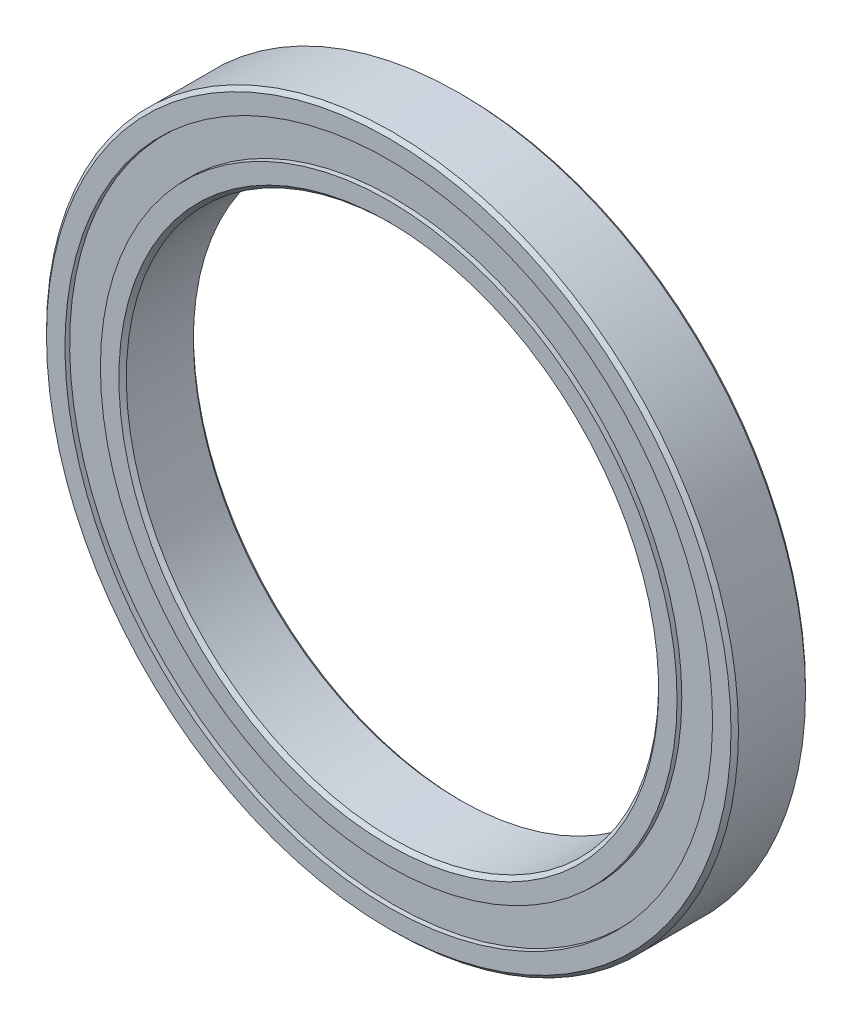
ISO-10303-21;
HEADER;
FILE_DESCRIPTION(('STEP AP214'),'2;1');
FILE_NAME('part.step','',(''),(''),'','','');
FILE_SCHEMA(('AUTOMOTIVE_DESIGN { 1 0 10303 214 1 1 1 1 }'));
ENDSEC;
DATA;
#1=APPLICATION_CONTEXT('core data for automotive mechanical design processes');
#2=APPLICATION_PROTOCOL_DEFINITION('international standard','automotive_design',2000,#1);
#3=PRODUCT_CONTEXT('',#1,'mechanical');
#4=PRODUCT('Part','Part','',(#3));
#5=PRODUCT_RELATED_PRODUCT_CATEGORY('part','',(#4));
#6=PRODUCT_DEFINITION_FORMATION('','',#4);
#7=PRODUCT_DEFINITION_CONTEXT('part definition',#1,'design');
#8=PRODUCT_DEFINITION('design','',#6,#7);
#9=PRODUCT_DEFINITION_SHAPE('','',#8);
#10=(LENGTH_UNIT() NAMED_UNIT(*) SI_UNIT(.MILLI.,.METRE.));
#11=(NAMED_UNIT(*) PLANE_ANGLE_UNIT() SI_UNIT($,.RADIAN.));
#12=(NAMED_UNIT(*) SI_UNIT($,.STERADIAN.) SOLID_ANGLE_UNIT());
#13=UNCERTAINTY_MEASURE_WITH_UNIT(LENGTH_MEASURE(1.E-05),#10,'distance_accuracy_value','');
#14=(GEOMETRIC_REPRESENTATION_CONTEXT(3) GLOBAL_UNCERTAINTY_ASSIGNED_CONTEXT((#13)) GLOBAL_UNIT_ASSIGNED_CONTEXT((#10,
#11,#12)) REPRESENTATION_CONTEXT('',''));
#15=CARTESIAN_POINT('',(0.,0.,0.));
#16=DIRECTION('',(0.,0.,1.));
#17=DIRECTION('',(1.,0.,0.));
#18=AXIS2_PLACEMENT_3D('',#15,#16,#17);
#19=CARTESIAN_POINT('',(7.75665717076408,27.6838720112493,0.));
#20=DIRECTION('',(0.,0.,1.));
#21=DIRECTION('',(0.269796771157012,0.962917287347803,0.));
#22=AXIS2_PLACEMENT_3D('',#19,#20,#21);
#23=SPHERICAL_SURFACE('',#22,2.27980939207591);
#24=CARTESIAN_POINT('',(7.75665717076408,27.6838720112493,2.27980939207591));
#25=VERTEX_POINT('',#24);
#26=VERTEX_LOOP('',#25);
#27=FACE_BOUND('',#26,.T.);
#28=ADVANCED_FACE('F37',(#27),#23,.T.);
#29=CLOSED_SHELL('',(#28));
#30=MANIFOLD_SOLID_BREP('B2',#29);
#31=CARTESIAN_POINT('',(14.9380385635184,24.5645578807117,0.));
#32=DIRECTION('',(0.,0.,1.));
#33=DIRECTION('',(0.519583950035423,0.854419404546495,0.));
#34=AXIS2_PLACEMENT_3D('',#31,#32,#33);
#35=SPHERICAL_SURFACE('',#34,2.27980939207591);
#36=CARTESIAN_POINT('',(14.9380385635184,24.5645578807117,2.27980939207591));
#37=VERTEX_POINT('',#36);
#38=VERTEX_LOOP('',#37);
#39=FACE_BOUND('',#38,.T.);
#40=ADVANCED_FACE('F55',(#39),#35,.T.);
#41=CLOSED_SHELL('',(#40));
#42=MANIFOLD_SOLID_BREP('B6',#41);
#43=CARTESIAN_POINT('',(21.0115339729958,19.6234028675366,0.));
#44=DIRECTION('',(0.,0.,1.));
#45=DIRECTION('',(0.730835964278116,0.682553143218663,0.));
#46=AXIS2_PLACEMENT_3D('',#43,#44,#45);
#47=SPHERICAL_SURFACE('',#46,2.27980939207591);
#48=CARTESIAN_POINT('',(21.0115339729958,19.6234028675366,2.27980939207591));
#49=VERTEX_POINT('',#48);
#50=VERTEX_LOOP('',#49);
#51=FACE_BOUND('',#50,.T.);
#52=ADVANCED_FACE('F73',(#51),#47,.T.);
#53=CLOSED_SHELL('',(#52));
#54=MANIFOLD_SOLID_BREP('B33',#53);
#55=CARTESIAN_POINT('',(25.5267000290681,13.2268698347709,0.));
#56=DIRECTION('',(0.,0.,1.));
#57=DIRECTION('',(0.88788521840237,0.460065037731162,0.));
#58=AXIS2_PLACEMENT_3D('',#55,#56,#57);
#59=SPHERICAL_SURFACE('',#58,2.27980939207591);
#60=CARTESIAN_POINT('',(25.5267000290681,13.2268698347709,2.27980939207591));
#61=VERTEX_POINT('',#60);
#62=VERTEX_LOOP('',#61);
#63=FACE_BOUND('',#62,.T.);
#64=ADVANCED_FACE('F91',(#63),#59,.T.);
#65=CLOSED_SHELL('',(#64));
#66=MANIFOLD_SOLID_BREP('B51',#65);
#67=CARTESIAN_POINT('',(28.1486675208667,5.84936037526353,0.));
#68=DIRECTION('',(0.,0.,1.));
#69=DIRECTION('',(0.979084087682321,0.203456013052645,0.));
#70=AXIS2_PLACEMENT_3D('',#67,#68,#69);
#71=SPHERICAL_SURFACE('',#70,2.27980939207591);
#72=CARTESIAN_POINT('',(28.1486675208667,5.84936037526353,2.27980939207591));
#73=VERTEX_POINT('',#72);
#74=VERTEX_LOOP('',#73);
#75=FACE_BOUND('',#74,.T.);
#76=ADVANCED_FACE('F109',(#75),#71,.T.);
#77=CLOSED_SHELL('',(#76));
#78=MANIFOLD_SOLID_BREP('B69',#77);
#79=CARTESIAN_POINT('',(28.682977114228,-1.961969384234,0.));
#80=DIRECTION('',(0.,0.,1.));
#81=DIRECTION('',(0.99766876919054,-0.0682424133646607,0.));
#82=AXIS2_PLACEMENT_3D('',#79,#80,#81);
#83=SPHERICAL_SURFACE('',#82,2.27980939207591);
#84=CARTESIAN_POINT('',(28.682977114228,-1.961969384234,2.2798093920759));
#85=VERTEX_POINT('',#84);
#86=VERTEX_LOOP('',#85);
#87=FACE_BOUND('',#86,.T.);
#88=ADVANCED_FACE('F127',(#87),#83,.T.);
#89=CLOSED_SHELL('',(#88));
#90=MANIFOLD_SOLID_BREP('B87',#89);
#91=CARTESIAN_POINT('',(27.0900015109162,-9.62778884991559,0.));
#92=DIRECTION('',(0.,0.,1.));
#93=DIRECTION('',(0.942260922118824,-0.334879612170977,0.));
#94=AXIS2_PLACEMENT_3D('',#91,#92,#93);
#95=SPHERICAL_SURFACE('',#94,2.27980939207591);
#96=CARTESIAN_POINT('',(27.0900015109162,-9.62778884991559,2.2798093920759));
#97=VERTEX_POINT('',#96);
#98=VERTEX_LOOP('',#97);
#99=FACE_BOUND('',#98,.T.);
#100=ADVANCED_FACE('F147',(#99),#95,.T.);
#101=CLOSED_SHELL('',(#100));
#102=MANIFOLD_SOLID_BREP('B105',#101);
#103=CARTESIAN_POINT('',(23.4878844240504,-16.5795592608022,0.));
#104=DIRECTION('',(0.,0.,1.));
#105=DIRECTION('',(0.816969893010447,-0.57668032211486,0.));
#106=AXIS2_PLACEMENT_3D('',#103,#104,#105);
#107=SPHERICAL_SURFACE('',#106,2.27980939207591);
#108=CARTESIAN_POINT('',(23.4878844240504,-16.5795592608022,2.2798093920759));
#109=VERTEX_POINT('',#108);
#110=VERTEX_LOOP('',#109);
#111=FACE_BOUND('',#110,.T.);
#112=ADVANCED_FACE('F167',(#111),#107,.T.);
#113=CLOSED_SHELL('',(#112));
#114=MANIFOLD_SOLID_BREP('B123',#113);
#115=CARTESIAN_POINT('',(18.1437783993742,-22.3016996077519,0.));
#116=DIRECTION('',(0.,0.,1.));
#117=DIRECTION('',(0.631087944326059,-0.775711290704414,0.));
#118=AXIS2_PLACEMENT_3D('',#115,#116,#117);
#119=SPHERICAL_SURFACE('',#118,2.27980939207591);
#120=CARTESIAN_POINT('',(18.1437783993742,-22.3016996077519,2.2798093920759));
#121=VERTEX_POINT('',#120);
#122=VERTEX_LOOP('',#121);
#123=FACE_BOUND('',#122,.T.);
#124=ADVANCED_FACE('F187',(#123),#119,.T.);
#125=CLOSED_SHELL('',(#124));
#126=MANIFOLD_SOLID_BREP('B143',#125);
#127=CARTESIAN_POINT('',(11.4540313330796,-26.3698249182817,0.));
#128=DIRECTION('',(0.,0.,1.));
#129=DIRECTION('',(0.398401089846249,-0.91721130150545,0.));
#130=AXIS2_PLACEMENT_3D('',#127,#128,#129);
#131=SPHERICAL_SURFACE('',#130,2.27980939207591);
#132=CARTESIAN_POINT('',(11.4540313330796,-26.3698249182817,2.2798093920759));
#133=VERTEX_POINT('',#132);
#134=VERTEX_LOOP('',#133);
#135=FACE_BOUND('',#134,.T.);
#136=ADVANCED_FACE('F207',(#135),#131,.T.);
#137=CLOSED_SHELL('',(#136));
#138=MANIFOLD_SOLID_BREP('B163',#137);
#139=CARTESIAN_POINT('',(3.9147911615173,-28.4822209485445,0.));
#140=DIRECTION('',(0.,0.,1.));
#141=DIRECTION('',(0.136166649096254,-0.99068594603633,0.));
#142=AXIS2_PLACEMENT_3D('',#139,#140,#141);
#143=SPHERICAL_SURFACE('',#142,2.27980939207591);
#144=CARTESIAN_POINT('',(3.9147911615173,-28.4822209485445,2.2798093920759));
#145=VERTEX_POINT('',#144);
#146=VERTEX_LOOP('',#145);
#147=FACE_BOUND('',#146,.T.);
#148=ADVANCED_FACE('F227',(#147),#143,.T.);
#149=CLOSED_SHELL('',(#148));
#150=MANIFOLD_SOLID_BREP('B183',#149);
#151=CARTESIAN_POINT('',(-3.9147911615169,-28.4822209485445,0.));
#152=DIRECTION('',(0.,0.,1.));
#153=DIRECTION('',(-0.13616664909624,-0.990685946036332,0.));
#154=AXIS2_PLACEMENT_3D('',#151,#152,#153);
#155=SPHERICAL_SURFACE('',#154,2.27980939207591);
#156=CARTESIAN_POINT('',(-3.9147911615169,-28.4822209485445,2.2798093920759));
#157=VERTEX_POINT('',#156);
#158=VERTEX_LOOP('',#157);
#159=FACE_BOUND('',#158,.T.);
#160=ADVANCED_FACE('F247',(#159),#155,.T.);
#161=CLOSED_SHELL('',(#160));
#162=MANIFOLD_SOLID_BREP('B203',#161);
#163=CARTESIAN_POINT('',(-11.4540313330793,-26.3698249182818,0.));
#164=DIRECTION('',(0.,0.,1.));
#165=DIRECTION('',(-0.398401089846236,-0.917211301505455,0.));
#166=AXIS2_PLACEMENT_3D('',#163,#164,#165);
#167=SPHERICAL_SURFACE('',#166,2.27980939207591);
#168=CARTESIAN_POINT('',(-11.4540313330793,-26.3698249182818,2.2798093920759));
#169=VERTEX_POINT('',#168);
#170=VERTEX_LOOP('',#169);
#171=FACE_BOUND('',#170,.T.);
#172=ADVANCED_FACE('F267',(#171),#167,.T.);
#173=CLOSED_SHELL('',(#172));
#174=MANIFOLD_SOLID_BREP('B223',#173);
#175=CARTESIAN_POINT('',(-18.1437783993739,-22.3016996077522,0.));
#176=DIRECTION('',(0.,0.,1.));
#177=DIRECTION('',(-0.631087944326049,-0.775711290704423,0.));
#178=AXIS2_PLACEMENT_3D('',#175,#176,#177);
#179=SPHERICAL_SURFACE('',#178,2.27980939207591);
#180=CARTESIAN_POINT('',(-18.1437783993739,-22.3016996077522,2.2798093920759));
#181=VERTEX_POINT('',#180);
#182=VERTEX_LOOP('',#181);
#183=FACE_BOUND('',#182,.T.);
#184=ADVANCED_FACE('F287',(#183),#179,.T.);
#185=CLOSED_SHELL('',(#184));
#186=MANIFOLD_SOLID_BREP('B243',#185);
#187=CARTESIAN_POINT('',(-23.4878844240501,-16.5795592608025,0.));
#188=DIRECTION('',(0.,0.,1.));
#189=DIRECTION('',(-0.816969893010439,-0.576680322114871,0.));
#190=AXIS2_PLACEMENT_3D('',#187,#188,#189);
#191=SPHERICAL_SURFACE('',#190,2.27980939207591);
#192=CARTESIAN_POINT('',(-23.4878844240501,-16.5795592608025,2.2798093920759));
#193=VERTEX_POINT('',#192);
#194=VERTEX_LOOP('',#193);
#195=FACE_BOUND('',#194,.T.);
#196=ADVANCED_FACE('F307',(#195),#191,.T.);
#197=CLOSED_SHELL('',(#196));
#198=MANIFOLD_SOLID_BREP('B263',#197);
#199=CARTESIAN_POINT('',(-27.0900015109161,-9.62778884991597,0.));
#200=DIRECTION('',(0.,0.,1.));
#201=DIRECTION('',(-0.942260922118819,-0.33487961217099,0.));
#202=AXIS2_PLACEMENT_3D('',#199,#200,#201);
#203=SPHERICAL_SURFACE('',#202,2.27980939207591);
#204=CARTESIAN_POINT('',(-27.0900015109161,-9.62778884991597,2.2798093920759));
#205=VERTEX_POINT('',#204);
#206=VERTEX_LOOP('',#205);
#207=FACE_BOUND('',#206,.T.);
#208=ADVANCED_FACE('F327',(#207),#203,.T.);
#209=CLOSED_SHELL('',(#208));
#210=MANIFOLD_SOLID_BREP('B283',#209);
#211=CARTESIAN_POINT('',(-28.682977114228,-1.9619693842344,0.));
#212=DIRECTION('',(0.,0.,1.));
#213=DIRECTION('',(-0.997668769190539,-0.0682424133646747,0.));
#214=AXIS2_PLACEMENT_3D('',#211,#212,#213);
#215=SPHERICAL_SURFACE('',#214,2.27980939207591);
#216=CARTESIAN_POINT('',(-28.682977114228,-1.9619693842344,2.2798093920759));
#217=VERTEX_POINT('',#216);
#218=VERTEX_LOOP('',#217);
#219=FACE_BOUND('',#218,.T.);
#220=ADVANCED_FACE('F347',(#219),#215,.T.);
#221=CLOSED_SHELL('',(#220));
#222=MANIFOLD_SOLID_BREP('B303',#221);
#223=CARTESIAN_POINT('',(-28.1486675208668,5.84936037526314,0.));
#224=DIRECTION('',(0.,0.,1.));
#225=DIRECTION('',(-0.979084087682323,0.203456013052631,0.));
#226=AXIS2_PLACEMENT_3D('',#223,#224,#225);
#227=SPHERICAL_SURFACE('',#226,2.27980939207591);
#228=CARTESIAN_POINT('',(-28.1486675208668,5.84936037526314,2.27980939207591));
#229=VERTEX_POINT('',#228);
#230=VERTEX_LOOP('',#229);
#231=FACE_BOUND('',#230,.T.);
#232=ADVANCED_FACE('F367',(#231),#227,.T.);
#233=CLOSED_SHELL('',(#232));
#234=MANIFOLD_SOLID_BREP('B323',#233);
#235=CARTESIAN_POINT('',(-25.5267000290683,13.2268698347706,0.));
#236=DIRECTION('',(0.,0.,1.));
#237=DIRECTION('',(-0.887885218402376,0.46006503773115,0.));
#238=AXIS2_PLACEMENT_3D('',#235,#236,#237);
#239=SPHERICAL_SURFACE('',#238,2.27980939207591);
#240=CARTESIAN_POINT('',(-25.5267000290683,13.2268698347706,2.27980939207591));
#241=VERTEX_POINT('',#240);
#242=VERTEX_LOOP('',#241);
#243=FACE_BOUND('',#242,.T.);
#244=ADVANCED_FACE('F387',(#243),#239,.T.);
#245=CLOSED_SHELL('',(#244));
#246=MANIFOLD_SOLID_BREP('B343',#245);
#247=CARTESIAN_POINT('',(-21.0115339729961,19.6234028675363,0.));
#248=DIRECTION('',(0.,0.,1.));
#249=DIRECTION('',(-0.730835964278125,0.682553143218653,0.));
#250=AXIS2_PLACEMENT_3D('',#247,#248,#249);
#251=SPHERICAL_SURFACE('',#250,2.27980939207591);
#252=CARTESIAN_POINT('',(-21.0115339729961,19.6234028675363,2.27980939207591));
#253=VERTEX_POINT('',#252);
#254=VERTEX_LOOP('',#253);
#255=FACE_BOUND('',#254,.T.);
#256=ADVANCED_FACE('F407',(#255),#251,.T.);
#257=CLOSED_SHELL('',(#256));
#258=MANIFOLD_SOLID_BREP('B363',#257);
#259=CARTESIAN_POINT('',(-14.9380385635187,24.5645578807115,0.));
#260=DIRECTION('',(0.,0.,1.));
#261=DIRECTION('',(-0.519583950035435,0.854419404546488,0.));
#262=AXIS2_PLACEMENT_3D('',#259,#260,#261);
#263=SPHERICAL_SURFACE('',#262,2.27980939207591);
#264=CARTESIAN_POINT('',(-14.9380385635187,24.5645578807115,2.27980939207591));
#265=VERTEX_POINT('',#264);
#266=VERTEX_LOOP('',#265);
#267=FACE_BOUND('',#266,.T.);
#268=ADVANCED_FACE('F427',(#267),#263,.T.);
#269=CLOSED_SHELL('',(#268));
#270=MANIFOLD_SOLID_BREP('B383',#269);
#271=CARTESIAN_POINT('',(-7.75665717076446,27.6838720112492,0.));
#272=DIRECTION('',(0.,0.,1.));
#273=DIRECTION('',(-0.269796771157025,0.962917287347799,0.));
#274=AXIS2_PLACEMENT_3D('',#271,#272,#273);
#275=SPHERICAL_SURFACE('',#274,2.27980939207591);
#276=CARTESIAN_POINT('',(-7.75665717076446,27.6838720112492,2.27980939207591));
#277=VERTEX_POINT('',#276);
#278=VERTEX_LOOP('',#277);
#279=FACE_BOUND('',#278,.T.);
#280=ADVANCED_FACE('F447',(#279),#275,.T.);
#281=CLOSED_SHELL('',(#280));
#282=MANIFOLD_SOLID_BREP('B403',#281);
#283=CARTESIAN_POINT('',(0.,28.75,0.));
#284=DIRECTION('',(0.,0.,1.));
#285=DIRECTION('',(0.,1.,0.));
#286=AXIS2_PLACEMENT_3D('',#283,#284,#285);
#287=SPHERICAL_SURFACE('',#286,2.27980939207591);
#288=CARTESIAN_POINT('',(0.,28.75,2.27980939207591));
#289=VERTEX_POINT('',#288);
#290=VERTEX_LOOP('',#289);
#291=FACE_BOUND('',#290,.T.);
#292=ADVANCED_FACE('F469',(#291),#287,.T.);
#293=CLOSED_SHELL('',(#292));
#294=MANIFOLD_SOLID_BREP('B423',#293);
#295=CARTESIAN_POINT('',(0.,27.0833333333333,3.50000000000003));
#296=DIRECTION('',(0.,0.,-1.));
#297=DIRECTION('',(0.,1.,0.));
#298=AXIS2_PLACEMENT_3D('',#295,#296,#297);
#299=PLANE('',#298);
#300=CARTESIAN_POINT('',(0.,0.,3.50000000000002));
#301=DIRECTION('',(0.,0.,1.));
#302=DIRECTION('',(0.,-1.,0.));
#303=AXIS2_PLACEMENT_3D('',#300,#301,#302);
#304=CIRCLE('',#303,25.35);
#305=CARTESIAN_POINT('',(0.,-25.35,3.50000000000002));
#306=VERTEX_POINT('',#305);
#307=EDGE_CURVE('E517',#306,#306,#304,.T.);
#308=ORIENTED_EDGE('',*,*,#307,.F.);
#309=EDGE_LOOP('',(#308));
#310=FACE_BOUND('',#309,.T.);
#311=CARTESIAN_POINT('',(0.,0.,3.50000000000002));
#312=DIRECTION('',(0.,0.,1.));
#313=DIRECTION('',(0.,-1.,0.));
#314=AXIS2_PLACEMENT_3D('',#311,#312,#313);
#315=CIRCLE('',#314,27.0833333333333);
#316=CARTESIAN_POINT('',(0.,-27.0833333333333,3.50000000000002));
#317=VERTEX_POINT('',#316);
#318=EDGE_CURVE('E468',#317,#317,#315,.T.);
#319=ORIENTED_EDGE('',*,*,#318,.T.);
#320=EDGE_LOOP('',(#319));
#321=FACE_BOUND('',#320,.T.);
#322=ADVANCED_FACE('F489',(#310,#321),#299,.F.);
#323=CARTESIAN_POINT('',(0.,0.,3.50000000000002));
#324=DIRECTION('',(0.,0.,1.));
#325=DIRECTION('',(0.,-1.,0.));
#326=AXIS2_PLACEMENT_3D('',#323,#324,#325);
#327=CYLINDRICAL_SURFACE('',#326,27.0833333333333);
#328=ORIENTED_EDGE('',*,*,#318,.F.);
#329=EDGE_LOOP('',(#328));
#330=FACE_BOUND('',#329,.T.);
#331=CARTESIAN_POINT('',(0.,0.,1.55555555555555));
#332=DIRECTION('',(0.,0.,1.));
#333=DIRECTION('',(0.,-1.,0.));
#334=AXIS2_PLACEMENT_3D('',#331,#332,#333);
#335=CIRCLE('',#334,27.0833333333333);
#336=CARTESIAN_POINT('',(0.,-27.0833333333333,1.55555555555555));
#337=VERTEX_POINT('',#336);
#338=EDGE_CURVE('E495',#337,#337,#335,.T.);
#339=ORIENTED_EDGE('',*,*,#338,.T.);
#340=EDGE_LOOP('',(#339));
#341=FACE_BOUND('',#340,.T.);
#342=ADVANCED_FACE('F524',(#330,#341),#327,.T.);
#343=CARTESIAN_POINT('',(0.,0.,0.));
#344=DIRECTION('',(0.,0.,1.));
#345=DIRECTION('',(0.,-1.,0.));
#346=AXIS2_PLACEMENT_3D('',#343,#344,#345);
#347=TOROIDAL_SURFACE('',#346,28.75,2.27980939207591);
#348=ORIENTED_EDGE('',*,*,#338,.F.);
#349=EDGE_LOOP('',(#348));
#350=FACE_BOUND('',#349,.T.);
#351=CARTESIAN_POINT('',(0.,0.,-1.55555555555556));
#352=DIRECTION('',(0.,0.,1.));
#353=DIRECTION('',(0.,-1.,0.));
#354=AXIS2_PLACEMENT_3D('',#351,#352,#353);
#355=CIRCLE('',#354,27.0833333333333);
#356=CARTESIAN_POINT('',(0.,-27.0833333333333,-1.55555555555556));
#357=VERTEX_POINT('',#356);
#358=EDGE_CURVE('E499',#357,#357,#355,.T.);
#359=ORIENTED_EDGE('',*,*,#358,.T.);
#360=EDGE_LOOP('',(#359));
#361=FACE_BOUND('',#360,.T.);
#362=ADVANCED_FACE('F528',(#350,#361),#347,.F.);
#363=CARTESIAN_POINT('',(0.,0.,3.50000000000002));
#364=DIRECTION('',(0.,0.,1.));
#365=DIRECTION('',(0.,-1.,0.));
#366=AXIS2_PLACEMENT_3D('',#363,#364,#365);
#367=CYLINDRICAL_SURFACE('',#366,27.0833333333333);
#368=ORIENTED_EDGE('',*,*,#358,.F.);
#369=EDGE_LOOP('',(#368));
#370=FACE_BOUND('',#369,.T.);
#371=CARTESIAN_POINT('',(0.,0.,-3.50000000000003));
#372=DIRECTION('',(0.,0.,1.));
#373=DIRECTION('',(0.,-1.,0.));
#374=AXIS2_PLACEMENT_3D('',#371,#372,#373);
#375=CIRCLE('',#374,27.0833333333333);
#376=CARTESIAN_POINT('',(0.,-27.0833333333333,-3.50000000000003));
#377=VERTEX_POINT('',#376);
#378=EDGE_CURVE('E503',#377,#377,#375,.T.);
#379=ORIENTED_EDGE('',*,*,#378,.T.);
#380=EDGE_LOOP('',(#379));
#381=FACE_BOUND('',#380,.T.);
#382=ADVANCED_FACE('F533',(#370,#381),#367,.T.);
#383=CARTESIAN_POINT('',(0.,25.35,-3.50000000000003));
#384=DIRECTION('',(0.,0.,1.));
#385=DIRECTION('',(0.,-1.,0.));
#386=AXIS2_PLACEMENT_3D('',#383,#384,#385);
#387=PLANE('',#386);
#388=ORIENTED_EDGE('',*,*,#378,.F.);
#389=EDGE_LOOP('',(#388));
#390=FACE_BOUND('',#389,.T.);
#391=CARTESIAN_POINT('',(0.,0.,-3.50000000000003));
#392=DIRECTION('',(0.,0.,1.));
#393=DIRECTION('',(0.,-1.,0.));
#394=AXIS2_PLACEMENT_3D('',#391,#392,#393);
#395=CIRCLE('',#394,25.35);
#396=CARTESIAN_POINT('',(0.,-25.35,-3.50000000000004));
#397=VERTEX_POINT('',#396);
#398=EDGE_CURVE('E508',#397,#397,#395,.T.);
#399=ORIENTED_EDGE('',*,*,#398,.T.);
#400=EDGE_LOOP('',(#399));
#401=FACE_BOUND('',#400,.T.);
#402=ADVANCED_FACE('F539',(#390,#401),#387,.F.);
#403=CARTESIAN_POINT('',(0.,0.,-3.15000000000003));
#404=DIRECTION('',(0.,0.,-1.));
#405=DIRECTION('',(0.,1.,0.));
#406=AXIS2_PLACEMENT_3D('',#403,#404,#405);
#407=CONICAL_SURFACE('',#406,25.,0.785398163397437);
#408=ORIENTED_EDGE('',*,*,#398,.F.);
#409=EDGE_LOOP('',(#408));
#410=FACE_BOUND('',#409,.T.);
#411=CARTESIAN_POINT('',(0.,0.,-3.15000000000003));
#412=DIRECTION('',(0.,0.,1.));
#413=DIRECTION('',(0.,-1.,0.));
#414=AXIS2_PLACEMENT_3D('',#411,#412,#413);
#415=CIRCLE('',#414,25.);
#416=CARTESIAN_POINT('',(0.,-25.,-3.15000000000003));
#417=VERTEX_POINT('',#416);
#418=EDGE_CURVE('E511',#417,#417,#415,.T.);
#419=ORIENTED_EDGE('',*,*,#418,.T.);
#420=EDGE_LOOP('',(#419));
#421=FACE_BOUND('',#420,.T.);
#422=ADVANCED_FACE('F543',(#410,#421),#407,.F.);
#423=CARTESIAN_POINT('',(0.,0.,3.50000000000002));
#424=DIRECTION('',(0.,0.,1.));
#425=DIRECTION('',(0.,-1.,0.));
#426=AXIS2_PLACEMENT_3D('',#423,#424,#425);
#427=CYLINDRICAL_SURFACE('',#426,25.);
#428=ORIENTED_EDGE('',*,*,#418,.F.);
#429=EDGE_LOOP('',(#428));
#430=FACE_BOUND('',#429,.T.);
#431=CARTESIAN_POINT('',(0.,0.,3.15000000000002));
#432=DIRECTION('',(0.,0.,1.));
#433=DIRECTION('',(0.,-1.,0.));
#434=AXIS2_PLACEMENT_3D('',#431,#432,#433);
#435=CIRCLE('',#434,25.);
#436=CARTESIAN_POINT('',(0.,-25.,3.15000000000002));
#437=VERTEX_POINT('',#436);
#438=EDGE_CURVE('E514',#437,#437,#435,.T.);
#439=ORIENTED_EDGE('',*,*,#438,.T.);
#440=EDGE_LOOP('',(#439));
#441=FACE_BOUND('',#440,.T.);
#442=ADVANCED_FACE('F547',(#430,#441),#427,.F.);
#443=CARTESIAN_POINT('',(0.,0.,3.50000000000002));
#444=DIRECTION('',(0.,0.,1.));
#445=DIRECTION('',(0.,-1.,0.));
#446=AXIS2_PLACEMENT_3D('',#443,#444,#445);
#447=CONICAL_SURFACE('',#446,25.35,0.785398163397441);
#448=ORIENTED_EDGE('',*,*,#438,.F.);
#449=EDGE_LOOP('',(#448));
#450=FACE_BOUND('',#449,.T.);
#451=ORIENTED_EDGE('',*,*,#307,.T.);
#452=EDGE_LOOP('',(#451));
#453=FACE_BOUND('',#452,.T.);
#454=ADVANCED_FACE('F521',(#450,#453),#447,.F.);
#455=CLOSED_SHELL('',(#322,#342,#362,#382,#402,#422,#442,#454));
#456=MANIFOLD_SOLID_BREP('B443',#455);
#457=CARTESIAN_POINT('',(0.,27.1087333333333,-2.69940469603797));
#458=DIRECTION('',(0.,0.,-1.));
#459=DIRECTION('',(0.,1.,0.));
#460=AXIS2_PLACEMENT_3D('',#457,#458,#459);
#461=PLANE('',#460);
#462=CARTESIAN_POINT('',(0.,0.,-2.69940469603797));
#463=DIRECTION('',(0.,0.,1.));
#464=DIRECTION('',(0.,-1.,0.));
#465=AXIS2_PLACEMENT_3D('',#462,#463,#464);
#466=CIRCLE('',#465,27.1087333333333);
#467=CARTESIAN_POINT('',(0.,-27.1087333333333,-2.69940469603798));
#468=VERTEX_POINT('',#467);
#469=EDGE_CURVE('E632',#468,#468,#466,.T.);
#470=ORIENTED_EDGE('',*,*,#469,.F.);
#471=EDGE_LOOP('',(#470));
#472=FACE_BOUND('',#471,.T.);
#473=CARTESIAN_POINT('',(0.,0.,-2.69940469603797));
#474=DIRECTION('',(0.,0.,1.));
#475=DIRECTION('',(0.,-1.,0.));
#476=AXIS2_PLACEMENT_3D('',#473,#474,#475);
#477=CIRCLE('',#476,30.3912666666667);
#478=CARTESIAN_POINT('',(0.,-30.3912666666667,-2.69940469603797));
#479=VERTEX_POINT('',#478);
#480=EDGE_CURVE('E488',#479,#479,#477,.T.);
#481=ORIENTED_EDGE('',*,*,#480,.T.);
#482=EDGE_LOOP('',(#481));
#483=FACE_BOUND('',#482,.T.);
#484=ADVANCED_FACE('F618',(#472,#483),#461,.F.);
#485=CARTESIAN_POINT('',(0.,0.,3.50000000000002));
#486=DIRECTION('',(0.,0.,1.));
#487=DIRECTION('',(0.,-1.,0.));
#488=AXIS2_PLACEMENT_3D('',#485,#486,#487);
#489=CYLINDRICAL_SURFACE('',#488,30.3912666666667);
#490=ORIENTED_EDGE('',*,*,#480,.F.);
#491=EDGE_LOOP('',(#490));
#492=FACE_BOUND('',#491,.T.);
#493=CARTESIAN_POINT('',(0.,0.,-3.08040469603797));
#494=DIRECTION('',(0.,0.,1.));
#495=DIRECTION('',(0.,-1.,0.));
#496=AXIS2_PLACEMENT_3D('',#493,#494,#495);
#497=CIRCLE('',#496,30.3912666666667);
#498=CARTESIAN_POINT('',(0.,-30.3912666666667,-3.08040469603797));
#499=VERTEX_POINT('',#498);
#500=EDGE_CURVE('E624',#499,#499,#497,.T.);
#501=ORIENTED_EDGE('',*,*,#500,.T.);
#502=EDGE_LOOP('',(#501));
#503=FACE_BOUND('',#502,.T.);
#504=ADVANCED_FACE('F641',(#492,#503),#489,.T.);
#505=CARTESIAN_POINT('',(0.,27.1087333333333,-3.08040469603797));
#506=DIRECTION('',(0.,0.,1.));
#507=DIRECTION('',(0.,-1.,0.));
#508=AXIS2_PLACEMENT_3D('',#505,#506,#507);
#509=PLANE('',#508);
#510=ORIENTED_EDGE('',*,*,#500,.F.);
#511=EDGE_LOOP('',(#510));
#512=FACE_BOUND('',#511,.T.);
#513=CARTESIAN_POINT('',(0.,0.,-3.08040469603797));
#514=DIRECTION('',(0.,0.,1.));
#515=DIRECTION('',(0.,-1.,0.));
#516=AXIS2_PLACEMENT_3D('',#513,#514,#515);
#517=CIRCLE('',#516,27.1087333333333);
#518=CARTESIAN_POINT('',(0.,-27.1087333333333,-3.08040469603797));
#519=VERTEX_POINT('',#518);
#520=EDGE_CURVE('E628',#519,#519,#517,.T.);
#521=ORIENTED_EDGE('',*,*,#520,.T.);
#522=EDGE_LOOP('',(#521));
#523=FACE_BOUND('',#522,.T.);
#524=ADVANCED_FACE('F645',(#512,#523),#509,.F.);
#525=CARTESIAN_POINT('',(0.,0.,3.50000000000002));
#526=DIRECTION('',(0.,0.,1.));
#527=DIRECTION('',(0.,-1.,0.));
#528=AXIS2_PLACEMENT_3D('',#525,#526,#527);
#529=CYLINDRICAL_SURFACE('',#528,27.1087333333333);
#530=ORIENTED_EDGE('',*,*,#520,.F.);
#531=EDGE_LOOP('',(#530));
#532=FACE_BOUND('',#531,.T.);
#533=ORIENTED_EDGE('',*,*,#469,.T.);
#534=EDGE_LOOP('',(#533));
#535=FACE_BOUND('',#534,.T.);
#536=ADVANCED_FACE('F638',(#532,#535),#529,.F.);
#537=CLOSED_SHELL('',(#484,#504,#524,#536));
#538=MANIFOLD_SOLID_BREP('B463',#537);
#539=CARTESIAN_POINT('',(0.,27.1087333333333,3.08040469603796));
#540=DIRECTION('',(0.,0.,-1.));
#541=DIRECTION('',(0.,1.,0.));
#542=AXIS2_PLACEMENT_3D('',#539,#540,#541);
#543=PLANE('',#542);
#544=CARTESIAN_POINT('',(0.,0.,3.08040469603796));
#545=DIRECTION('',(0.,0.,1.));
#546=DIRECTION('',(0.,-1.,0.));
#547=AXIS2_PLACEMENT_3D('',#544,#545,#546);
#548=CIRCLE('',#547,27.1087333333333);
#549=CARTESIAN_POINT('',(0.,-27.1087333333333,3.08040469603795));
#550=VERTEX_POINT('',#549);
#551=EDGE_CURVE('E617',#550,#550,#548,.T.);
#552=ORIENTED_EDGE('',*,*,#551,.F.);
#553=EDGE_LOOP('',(#552));
#554=FACE_BOUND('',#553,.T.);
#555=CARTESIAN_POINT('',(0.,0.,3.08040469603796));
#556=DIRECTION('',(0.,0.,1.));
#557=DIRECTION('',(0.,-1.,0.));
#558=AXIS2_PLACEMENT_3D('',#555,#556,#557);
#559=CIRCLE('',#558,30.3912666666667);
#560=CARTESIAN_POINT('',(0.,-30.3912666666667,3.08040469603795));
#561=VERTEX_POINT('',#560);
#562=EDGE_CURVE('E700',#561,#561,#559,.T.);
#563=ORIENTED_EDGE('',*,*,#562,.T.);
#564=EDGE_LOOP('',(#563));
#565=FACE_BOUND('',#564,.T.);
#566=ADVANCED_FACE('F686',(#554,#565),#543,.F.);
#567=CARTESIAN_POINT('',(0.,0.,3.50000000000002));
#568=DIRECTION('',(0.,0.,1.));
#569=DIRECTION('',(0.,-1.,0.));
#570=AXIS2_PLACEMENT_3D('',#567,#568,#569);
#571=CYLINDRICAL_SURFACE('',#570,27.1087333333333);
#572=CARTESIAN_POINT('',(0.,0.,2.69940469603796));
#573=DIRECTION('',(0.,0.,1.));
#574=DIRECTION('',(0.,-1.,0.));
#575=AXIS2_PLACEMENT_3D('',#572,#573,#574);
#576=CIRCLE('',#575,27.1087333333333);
#577=CARTESIAN_POINT('',(0.,-27.1087333333333,2.69940469603796));
#578=VERTEX_POINT('',#577);
#579=EDGE_CURVE('E692',#578,#578,#576,.T.);
#580=ORIENTED_EDGE('',*,*,#579,.F.);
#581=EDGE_LOOP('',(#580));
#582=FACE_BOUND('',#581,.T.);
#583=ORIENTED_EDGE('',*,*,#551,.T.);
#584=EDGE_LOOP('',(#583));
#585=FACE_BOUND('',#584,.T.);
#586=ADVANCED_FACE('F715',(#582,#585),#571,.F.);
#587=CARTESIAN_POINT('',(0.,27.1087333333333,2.69940469603796));
#588=DIRECTION('',(0.,0.,1.));
#589=DIRECTION('',(0.,-1.,0.));
#590=AXIS2_PLACEMENT_3D('',#587,#588,#589);
#591=PLANE('',#590);
#592=CARTESIAN_POINT('',(0.,0.,2.69940469603796));
#593=DIRECTION('',(0.,0.,1.));
#594=DIRECTION('',(0.,-1.,0.));
#595=AXIS2_PLACEMENT_3D('',#592,#593,#594);
#596=CIRCLE('',#595,30.3912666666667);
#597=CARTESIAN_POINT('',(0.,-30.3912666666667,2.69940469603795));
#598=VERTEX_POINT('',#597);
#599=EDGE_CURVE('E696',#598,#598,#596,.T.);
#600=ORIENTED_EDGE('',*,*,#599,.F.);
#601=EDGE_LOOP('',(#600));
#602=FACE_BOUND('',#601,.T.);
#603=ORIENTED_EDGE('',*,*,#579,.T.);
#604=EDGE_LOOP('',(#603));
#605=FACE_BOUND('',#604,.T.);
#606=ADVANCED_FACE('F710',(#602,#605),#591,.F.);
#607=CARTESIAN_POINT('',(0.,0.,3.50000000000002));
#608=DIRECTION('',(0.,0.,1.));
#609=DIRECTION('',(0.,-1.,0.));
#610=AXIS2_PLACEMENT_3D('',#607,#608,#609);
#611=CYLINDRICAL_SURFACE('',#610,30.3912666666667);
#612=ORIENTED_EDGE('',*,*,#562,.F.);
#613=EDGE_LOOP('',(#612));
#614=FACE_BOUND('',#613,.T.);
#615=ORIENTED_EDGE('',*,*,#599,.T.);
#616=EDGE_LOOP('',(#615));
#617=FACE_BOUND('',#616,.T.);
#618=ADVANCED_FACE('F707',(#614,#617),#611,.T.);
#619=CLOSED_SHELL('',(#566,#586,#606,#618));
#620=MANIFOLD_SOLID_BREP('B483',#619);
#621=CARTESIAN_POINT('',(0.,0.,3.15000000000001));
#622=DIRECTION('',(0.,0.,-1.));
#623=DIRECTION('',(0.,1.,0.));
#624=AXIS2_PLACEMENT_3D('',#621,#622,#623);
#625=CONICAL_SURFACE('',#624,32.5,0.785398163397452);
#626=CARTESIAN_POINT('',(0.,0.,3.50000000000001));
#627=DIRECTION('',(0.,0.,1.));
#628=DIRECTION('',(0.,-1.,0.));
#629=AXIS2_PLACEMENT_3D('',#626,#627,#628);
#630=CIRCLE('',#629,32.15);
#631=CARTESIAN_POINT('',(0.,-32.15,3.50000000000001));
#632=VERTEX_POINT('',#631);
#633=EDGE_CURVE('E775',#632,#632,#630,.T.);
#634=ORIENTED_EDGE('',*,*,#633,.F.);
#635=EDGE_LOOP('',(#634));
#636=FACE_BOUND('',#635,.T.);
#637=CARTESIAN_POINT('',(0.,0.,3.15000000000001));
#638=DIRECTION('',(0.,0.,1.));
#639=DIRECTION('',(0.,-1.,0.));
#640=AXIS2_PLACEMENT_3D('',#637,#638,#639);
#641=CIRCLE('',#640,32.5);
#642=CARTESIAN_POINT('',(0.,-32.5,3.15000000000001));
#643=VERTEX_POINT('',#642);
#644=EDGE_CURVE('E685',#643,#643,#641,.T.);
#645=ORIENTED_EDGE('',*,*,#644,.T.);
#646=EDGE_LOOP('',(#645));
#647=FACE_BOUND('',#646,.T.);
#648=ADVANCED_FACE('F747',(#636,#647),#625,.T.);
#649=CARTESIAN_POINT('',(0.,0.,3.50000000000002));
#650=DIRECTION('',(0.,0.,1.));
#651=DIRECTION('',(0.,-1.,0.));
#652=AXIS2_PLACEMENT_3D('',#649,#650,#651);
#653=CYLINDRICAL_SURFACE('',#652,32.5);
#654=ORIENTED_EDGE('',*,*,#644,.F.);
#655=EDGE_LOOP('',(#654));
#656=FACE_BOUND('',#655,.T.);
#657=CARTESIAN_POINT('',(0.,0.,-3.15000000000003));
#658=DIRECTION('',(0.,0.,1.));
#659=DIRECTION('',(0.,-1.,0.));
#660=AXIS2_PLACEMENT_3D('',#657,#658,#659);
#661=CIRCLE('',#660,32.5);
#662=CARTESIAN_POINT('',(0.,-32.5,-3.15000000000003));
#663=VERTEX_POINT('',#662);
#664=EDGE_CURVE('E753',#663,#663,#661,.T.);
#665=ORIENTED_EDGE('',*,*,#664,.T.);
#666=EDGE_LOOP('',(#665));
#667=FACE_BOUND('',#666,.T.);
#668=ADVANCED_FACE('F782',(#656,#667),#653,.T.);
#669=CARTESIAN_POINT('',(0.,0.,-3.50000000000003));
#670=DIRECTION('',(0.,0.,1.));
#671=DIRECTION('',(0.,-1.,0.));
#672=AXIS2_PLACEMENT_3D('',#669,#670,#671);
#673=CONICAL_SURFACE('',#672,32.15,0.785398163397452);
#674=ORIENTED_EDGE('',*,*,#664,.F.);
#675=EDGE_LOOP('',(#674));
#676=FACE_BOUND('',#675,.T.);
#677=CARTESIAN_POINT('',(0.,0.,-3.50000000000003));
#678=DIRECTION('',(0.,0.,1.));
#679=DIRECTION('',(0.,-1.,0.));
#680=AXIS2_PLACEMENT_3D('',#677,#678,#679);
#681=CIRCLE('',#680,32.15);
#682=CARTESIAN_POINT('',(0.,-32.15,-3.50000000000003));
#683=VERTEX_POINT('',#682);
#684=EDGE_CURVE('E757',#683,#683,#681,.T.);
#685=ORIENTED_EDGE('',*,*,#684,.T.);
#686=EDGE_LOOP('',(#685));
#687=FACE_BOUND('',#686,.T.);
#688=ADVANCED_FACE('F786',(#676,#687),#673,.T.);
#689=CARTESIAN_POINT('',(0.,32.15,-3.50000000000002));
#690=DIRECTION('',(0.,0.,1.));
#691=DIRECTION('',(0.,-1.,0.));
#692=AXIS2_PLACEMENT_3D('',#689,#690,#691);
#693=PLANE('',#692);
#694=ORIENTED_EDGE('',*,*,#684,.F.);
#695=EDGE_LOOP('',(#694));
#696=FACE_BOUND('',#695,.T.);
#697=CARTESIAN_POINT('',(0.,0.,-3.50000000000003));
#698=DIRECTION('',(0.,0.,1.));
#699=DIRECTION('',(0.,-1.,0.));
#700=AXIS2_PLACEMENT_3D('',#697,#698,#699);
#701=CIRCLE('',#700,30.4166666666667);
#702=CARTESIAN_POINT('',(0.,-30.4166666666667,-3.50000000000003));
#703=VERTEX_POINT('',#702);
#704=EDGE_CURVE('E761',#703,#703,#701,.T.);
#705=ORIENTED_EDGE('',*,*,#704,.T.);
#706=EDGE_LOOP('',(#705));
#707=FACE_BOUND('',#706,.T.);
#708=ADVANCED_FACE('F791',(#696,#707),#693,.F.);
#709=CARTESIAN_POINT('',(0.,0.,3.50000000000002));
#710=DIRECTION('',(0.,0.,1.));
#711=DIRECTION('',(0.,-1.,0.));
#712=AXIS2_PLACEMENT_3D('',#709,#710,#711);
#713=CYLINDRICAL_SURFACE('',#712,30.4166666666667);
#714=ORIENTED_EDGE('',*,*,#704,.F.);
#715=EDGE_LOOP('',(#714));
#716=FACE_BOUND('',#715,.T.);
#717=CARTESIAN_POINT('',(0.,0.,-1.55555555555556));
#718=DIRECTION('',(0.,0.,1.));
#719=DIRECTION('',(0.,-1.,0.));
#720=AXIS2_PLACEMENT_3D('',#717,#718,#719);
#721=CIRCLE('',#720,30.4166666666667);
#722=CARTESIAN_POINT('',(0.,-30.4166666666667,-1.55555555555557));
#723=VERTEX_POINT('',#722);
#724=EDGE_CURVE('E766',#723,#723,#721,.T.);
#725=ORIENTED_EDGE('',*,*,#724,.T.);
#726=EDGE_LOOP('',(#725));
#727=FACE_BOUND('',#726,.T.);
#728=ADVANCED_FACE('F797',(#716,#727),#713,.F.);
#729=CARTESIAN_POINT('',(0.,0.,0.));
#730=DIRECTION('',(0.,0.,1.));
#731=DIRECTION('',(0.,-1.,0.));
#732=AXIS2_PLACEMENT_3D('',#729,#730,#731);
#733=TOROIDAL_SURFACE('',#732,28.75,2.27980939207591);
#734=ORIENTED_EDGE('',*,*,#724,.F.);
#735=EDGE_LOOP('',(#734));
#736=FACE_BOUND('',#735,.T.);
#737=CARTESIAN_POINT('',(0.,0.,1.55555555555555));
#738=DIRECTION('',(0.,0.,1.));
#739=DIRECTION('',(0.,-1.,0.));
#740=AXIS2_PLACEMENT_3D('',#737,#738,#739);
#741=CIRCLE('',#740,30.4166666666667);
#742=CARTESIAN_POINT('',(0.,-30.4166666666667,1.55555555555555));
#743=VERTEX_POINT('',#742);
#744=EDGE_CURVE('E769',#743,#743,#741,.T.);
#745=ORIENTED_EDGE('',*,*,#744,.T.);
#746=EDGE_LOOP('',(#745));
#747=FACE_BOUND('',#746,.T.);
#748=ADVANCED_FACE('F801',(#736,#747),#733,.F.);
#749=CARTESIAN_POINT('',(0.,0.,3.50000000000002));
#750=DIRECTION('',(0.,0.,1.));
#751=DIRECTION('',(0.,-1.,0.));
#752=AXIS2_PLACEMENT_3D('',#749,#750,#751);
#753=CYLINDRICAL_SURFACE('',#752,30.4166666666667);
#754=ORIENTED_EDGE('',*,*,#744,.F.);
#755=EDGE_LOOP('',(#754));
#756=FACE_BOUND('',#755,.T.);
#757=CARTESIAN_POINT('',(0.,0.,3.50000000000001));
#758=DIRECTION('',(0.,0.,1.));
#759=DIRECTION('',(0.,-1.,0.));
#760=AXIS2_PLACEMENT_3D('',#757,#758,#759);
#761=CIRCLE('',#760,30.4166666666667);
#762=CARTESIAN_POINT('',(0.,-30.4166666666667,3.50000000000001));
#763=VERTEX_POINT('',#762);
#764=EDGE_CURVE('E772',#763,#763,#761,.T.);
#765=ORIENTED_EDGE('',*,*,#764,.T.);
#766=EDGE_LOOP('',(#765));
#767=FACE_BOUND('',#766,.T.);
#768=ADVANCED_FACE('F805',(#756,#767),#753,.F.);
#769=CARTESIAN_POINT('',(0.,32.15,3.50000000000002));
#770=DIRECTION('',(0.,0.,-1.));
#771=DIRECTION('',(0.,1.,0.));
#772=AXIS2_PLACEMENT_3D('',#769,#770,#771);
#773=PLANE('',#772);
#774=ORIENTED_EDGE('',*,*,#764,.F.);
#775=EDGE_LOOP('',(#774));
#776=FACE_BOUND('',#775,.T.);
#777=ORIENTED_EDGE('',*,*,#633,.T.);
#778=EDGE_LOOP('',(#777));
#779=FACE_BOUND('',#778,.T.);
#780=ADVANCED_FACE('F779',(#776,#779),#773,.F.);
#781=CLOSED_SHELL('',(#648,#668,#688,#708,#728,#748,#768,#780));
#782=MANIFOLD_SOLID_BREP('B612',#781);
#783=ADVANCED_BREP_SHAPE_REPRESENTATION('',(#18,#30,#42,#54,#66,#78,#90,#102,#114,#126,#138,
#150,#162,#174,#186,#198,#210,#222,#234,#246,#258,#270,#282,#294,#456,#538,#620,#782),#14);
#784=SHAPE_DEFINITION_REPRESENTATION(#9,#783);
ENDSEC;
END-ISO-10303-21;
